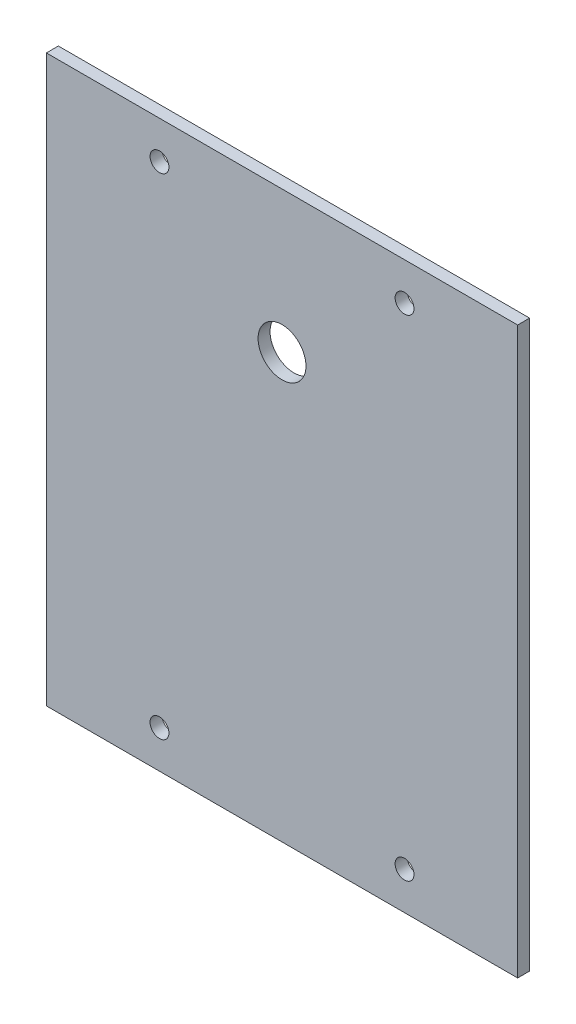
ISO-10303-21;
HEADER;
FILE_DESCRIPTION(('STEP AP214'),'2;1');
FILE_NAME('part.step','',(''),(''),'','','');
FILE_SCHEMA(('AUTOMOTIVE_DESIGN { 1 0 10303 214 1 1 1 1 }'));
ENDSEC;
DATA;
#1=APPLICATION_CONTEXT('core data for automotive mechanical design processes');
#2=APPLICATION_PROTOCOL_DEFINITION('international standard','automotive_design',2000,#1);
#3=PRODUCT_CONTEXT('',#1,'mechanical');
#4=PRODUCT('Part','Part','',(#3));
#5=PRODUCT_RELATED_PRODUCT_CATEGORY('part','',(#4));
#6=PRODUCT_DEFINITION_FORMATION('','',#4);
#7=PRODUCT_DEFINITION_CONTEXT('part definition',#1,'design');
#8=PRODUCT_DEFINITION('design','',#6,#7);
#9=PRODUCT_DEFINITION_SHAPE('','',#8);
#10=(LENGTH_UNIT() NAMED_UNIT(*) SI_UNIT(.MILLI.,.METRE.));
#11=(NAMED_UNIT(*) PLANE_ANGLE_UNIT() SI_UNIT($,.RADIAN.));
#12=(NAMED_UNIT(*) SI_UNIT($,.STERADIAN.) SOLID_ANGLE_UNIT());
#13=UNCERTAINTY_MEASURE_WITH_UNIT(LENGTH_MEASURE(1.E-05),#10,'distance_accuracy_value','');
#14=(GEOMETRIC_REPRESENTATION_CONTEXT(3) GLOBAL_UNCERTAINTY_ASSIGNED_CONTEXT((#13)) GLOBAL_UNIT_ASSIGNED_CONTEXT((#10,
#11,#12)) REPRESENTATION_CONTEXT('',''));
#15=CARTESIAN_POINT('',(0.,0.,0.));
#16=DIRECTION('',(0.,0.,1.));
#17=DIRECTION('',(1.,0.,0.));
#18=AXIS2_PLACEMENT_3D('',#15,#16,#17);
#19=CARTESIAN_POINT('',(-125.,150.,3.175));
#20=DIRECTION('',(1.,0.,0.));
#21=DIRECTION('',(0.,1.,0.));
#22=AXIS2_PLACEMENT_3D('',#19,#20,#21);
#23=PLANE('',#22);
#24=DIRECTION('',(0.,-1.,0.));
#25=VECTOR('',#24,1.);
#26=CARTESIAN_POINT('',(-125.,150.,0.));
#27=LINE('',#26,#25);
#28=CARTESIAN_POINT('',(-125.,150.,0.));
#29=VERTEX_POINT('',#28);
#30=CARTESIAN_POINT('',(-125.,0.,0.));
#31=VERTEX_POINT('',#30);
#32=EDGE_CURVE('E100',#29,#31,#27,.T.);
#33=ORIENTED_EDGE('',*,*,#32,.T.);
#34=DIRECTION('',(0.,0.,-1.));
#35=VECTOR('',#34,1.);
#36=CARTESIAN_POINT('',(-125.,0.,3.175));
#37=LINE('',#36,#35);
#38=CARTESIAN_POINT('',(-125.,0.,3.175));
#39=VERTEX_POINT('',#38);
#40=EDGE_CURVE('E11',#39,#31,#37,.T.);
#41=ORIENTED_EDGE('',*,*,#40,.F.);
#42=DIRECTION('',(0.,-1.,0.));
#43=VECTOR('',#42,1.);
#44=CARTESIAN_POINT('',(-125.,150.,3.175));
#45=LINE('',#44,#43);
#46=CARTESIAN_POINT('',(-125.,150.,3.175));
#47=VERTEX_POINT('',#46);
#48=EDGE_CURVE('E88',#47,#39,#45,.T.);
#49=ORIENTED_EDGE('',*,*,#48,.F.);
#50=DIRECTION('',(0.,0.,-1.));
#51=VECTOR('',#50,1.);
#52=CARTESIAN_POINT('',(-125.,150.,3.175));
#53=LINE('',#52,#51);
#54=EDGE_CURVE('E96',#47,#29,#53,.T.);
#55=ORIENTED_EDGE('',*,*,#54,.T.);
#56=EDGE_LOOP('',(#33,#41,#49,#55));
#57=FACE_BOUND('',#56,.T.);
#58=ADVANCED_FACE('F37',(#57),#23,.F.);
#59=CARTESIAN_POINT('',(-125.,0.,3.175));
#60=DIRECTION('',(0.,1.,0.));
#61=DIRECTION('',(0.,0.,1.));
#62=AXIS2_PLACEMENT_3D('',#59,#60,#61);
#63=PLANE('',#62);
#64=DIRECTION('',(1.,0.,0.));
#65=VECTOR('',#64,1.);
#66=CARTESIAN_POINT('',(-125.,0.,0.));
#67=LINE('',#66,#65);
#68=CARTESIAN_POINT('',(0.,0.,0.));
#69=VERTEX_POINT('',#68);
#70=EDGE_CURVE('E92',#31,#69,#67,.T.);
#71=ORIENTED_EDGE('',*,*,#70,.T.);
#72=DIRECTION('',(0.,0.,-1.));
#73=VECTOR('',#72,1.);
#74=CARTESIAN_POINT('',(0.,0.,3.175));
#75=LINE('',#74,#73);
#76=CARTESIAN_POINT('',(0.,0.,3.175));
#77=VERTEX_POINT('',#76);
#78=EDGE_CURVE('E45',#77,#69,#75,.T.);
#79=ORIENTED_EDGE('',*,*,#78,.F.);
#80=DIRECTION('',(1.,0.,0.));
#81=VECTOR('',#80,1.);
#82=CARTESIAN_POINT('',(-125.,0.,3.175));
#83=LINE('',#82,#81);
#84=EDGE_CURVE('E83',#39,#77,#83,.T.);
#85=ORIENTED_EDGE('',*,*,#84,.F.);
#86=ORIENTED_EDGE('',*,*,#40,.T.);
#87=EDGE_LOOP('',(#71,#79,#85,#86));
#88=FACE_BOUND('',#87,.T.);
#89=ADVANCED_FACE('F91',(#88),#63,.F.);
#90=CARTESIAN_POINT('',(0.,150.,3.175));
#91=DIRECTION('',(-1.,0.,0.));
#92=DIRECTION('',(0.,-1.,0.));
#93=AXIS2_PLACEMENT_3D('',#90,#91,#92);
#94=PLANE('',#93);
#95=DIRECTION('',(0.,1.,0.));
#96=VECTOR('',#95,1.);
#97=CARTESIAN_POINT('',(0.,150.,0.));
#98=LINE('',#97,#96);
#99=CARTESIAN_POINT('',(0.,150.,0.));
#100=VERTEX_POINT('',#99);
#101=EDGE_CURVE('E70',#69,#100,#98,.T.);
#102=ORIENTED_EDGE('',*,*,#101,.T.);
#103=DIRECTION('',(0.,0.,-1.));
#104=VECTOR('',#103,1.);
#105=CARTESIAN_POINT('',(0.,150.,3.175));
#106=LINE('',#105,#104);
#107=CARTESIAN_POINT('',(0.,150.,3.175));
#108=VERTEX_POINT('',#107);
#109=EDGE_CURVE('E93',#108,#100,#106,.T.);
#110=ORIENTED_EDGE('',*,*,#109,.F.);
#111=DIRECTION('',(0.,1.,0.));
#112=VECTOR('',#111,1.);
#113=CARTESIAN_POINT('',(0.,150.,3.175));
#114=LINE('',#113,#112);
#115=EDGE_CURVE('E86',#77,#108,#114,.T.);
#116=ORIENTED_EDGE('',*,*,#115,.F.);
#117=ORIENTED_EDGE('',*,*,#78,.T.);
#118=EDGE_LOOP('',(#102,#110,#116,#117));
#119=FACE_BOUND('',#118,.T.);
#120=ADVANCED_FACE('F94',(#119),#94,.F.);
#121=CARTESIAN_POINT('',(-125.,150.,3.175));
#122=DIRECTION('',(0.,-1.,0.));
#123=DIRECTION('',(0.,0.,-1.));
#124=AXIS2_PLACEMENT_3D('',#121,#122,#123);
#125=PLANE('',#124);
#126=DIRECTION('',(-1.,0.,0.));
#127=VECTOR('',#126,1.);
#128=CARTESIAN_POINT('',(-125.,150.,0.));
#129=LINE('',#128,#127);
#130=EDGE_CURVE('E76',#100,#29,#129,.T.);
#131=ORIENTED_EDGE('',*,*,#130,.T.);
#132=ORIENTED_EDGE('',*,*,#54,.F.);
#133=DIRECTION('',(-1.,0.,0.));
#134=VECTOR('',#133,1.);
#135=CARTESIAN_POINT('',(-125.,150.,3.175));
#136=LINE('',#135,#134);
#137=EDGE_CURVE('E53',#108,#47,#136,.T.);
#138=ORIENTED_EDGE('',*,*,#137,.F.);
#139=ORIENTED_EDGE('',*,*,#109,.T.);
#140=EDGE_LOOP('',(#131,#132,#138,#139));
#141=FACE_BOUND('',#140,.T.);
#142=ADVANCED_FACE('F108',(#141),#125,.F.);
#143=CARTESIAN_POINT('',(0.,0.,3.175));
#144=DIRECTION('',(0.,0.,1.));
#145=DIRECTION('',(1.,0.,0.));
#146=AXIS2_PLACEMENT_3D('',#143,#144,#145);
#147=PLANE('',#146);
#148=CARTESIAN_POINT('',(-62.5,112.5,3.175));
#149=DIRECTION('',(0.,0.,1.));
#150=DIRECTION('',(1.,0.,0.));
#151=AXIS2_PLACEMENT_3D('',#148,#149,#150);
#152=CIRCLE('',#151,6.35);
#153=CARTESIAN_POINT('',(-56.15,112.5,3.175));
#154=VERTEX_POINT('',#153);
#155=EDGE_CURVE('E140',#154,#154,#152,.T.);
#156=ORIENTED_EDGE('',*,*,#155,.F.);
#157=EDGE_LOOP('',(#156));
#158=FACE_BOUND('',#157,.T.);
#159=CARTESIAN_POINT('',(-95.,10.,3.175));
#160=DIRECTION('',(0.,0.,-1.));
#161=DIRECTION('',(1.,0.,0.));
#162=AXIS2_PLACEMENT_3D('',#159,#160,#161);
#163=CIRCLE('',#162,2.5);
#164=CARTESIAN_POINT('',(-92.5,10.,3.175));
#165=VERTEX_POINT('',#164);
#166=EDGE_CURVE('E129',#165,#165,#163,.T.);
#167=ORIENTED_EDGE('',*,*,#166,.T.);
#168=EDGE_LOOP('',(#167));
#169=FACE_BOUND('',#168,.T.);
#170=CARTESIAN_POINT('',(-30.,10.,3.175));
#171=DIRECTION('',(0.,0.,-1.));
#172=DIRECTION('',(1.,0.,0.));
#173=AXIS2_PLACEMENT_3D('',#170,#171,#172);
#174=CIRCLE('',#173,2.5);
#175=CARTESIAN_POINT('',(-27.5,10.,3.175));
#176=VERTEX_POINT('',#175);
#177=EDGE_CURVE('E130',#176,#176,#174,.T.);
#178=ORIENTED_EDGE('',*,*,#177,.T.);
#179=EDGE_LOOP('',(#178));
#180=FACE_BOUND('',#179,.T.);
#181=CARTESIAN_POINT('',(-95.,140.,3.175));
#182=DIRECTION('',(0.,0.,1.));
#183=DIRECTION('',(1.,0.,0.));
#184=AXIS2_PLACEMENT_3D('',#181,#182,#183);
#185=CIRCLE('',#184,2.5);
#186=CARTESIAN_POINT('',(-92.5,140.,3.175));
#187=VERTEX_POINT('',#186);
#188=EDGE_CURVE('E117',#187,#187,#185,.T.);
#189=ORIENTED_EDGE('',*,*,#188,.F.);
#190=EDGE_LOOP('',(#189));
#191=FACE_BOUND('',#190,.T.);
#192=CARTESIAN_POINT('',(-30.,140.,3.175));
#193=DIRECTION('',(0.,0.,1.));
#194=DIRECTION('',(1.,0.,0.));
#195=AXIS2_PLACEMENT_3D('',#192,#193,#194);
#196=CIRCLE('',#195,2.5);
#197=CARTESIAN_POINT('',(-27.5,140.,3.175));
#198=VERTEX_POINT('',#197);
#199=EDGE_CURVE('E114',#198,#198,#196,.T.);
#200=ORIENTED_EDGE('',*,*,#199,.F.);
#201=EDGE_LOOP('',(#200));
#202=FACE_BOUND('',#201,.T.);
#203=ORIENTED_EDGE('',*,*,#48,.T.);
#204=ORIENTED_EDGE('',*,*,#84,.T.);
#205=ORIENTED_EDGE('',*,*,#115,.T.);
#206=ORIENTED_EDGE('',*,*,#137,.T.);
#207=EDGE_LOOP('',(#203,#204,#205,#206));
#208=FACE_BOUND('',#207,.T.);
#209=ADVANCED_FACE('F84',(#158,#169,#180,#191,#202,#208),#147,.T.);
#210=CARTESIAN_POINT('',(0.,0.,0.));
#211=DIRECTION('',(0.,0.,1.));
#212=DIRECTION('',(1.,0.,0.));
#213=AXIS2_PLACEMENT_3D('',#210,#211,#212);
#214=PLANE('',#213);
#215=CARTESIAN_POINT('',(-62.5,112.5,0.));
#216=DIRECTION('',(0.,0.,1.));
#217=DIRECTION('',(1.,0.,0.));
#218=AXIS2_PLACEMENT_3D('',#215,#216,#217);
#219=CIRCLE('',#218,6.35);
#220=CARTESIAN_POINT('',(-56.15,112.5,0.));
#221=VERTEX_POINT('',#220);
#222=EDGE_CURVE('E133',#221,#221,#219,.F.);
#223=ORIENTED_EDGE('',*,*,#222,.F.);
#224=EDGE_LOOP('',(#223));
#225=FACE_BOUND('',#224,.T.);
#226=CARTESIAN_POINT('',(-95.,10.,0.));
#227=DIRECTION('',(0.,0.,1.));
#228=DIRECTION('',(1.,0.,0.));
#229=AXIS2_PLACEMENT_3D('',#226,#227,#228);
#230=CIRCLE('',#229,2.5);
#231=CARTESIAN_POINT('',(-92.5,10.,0.));
#232=VERTEX_POINT('',#231);
#233=EDGE_CURVE('E121',#232,#232,#230,.T.);
#234=ORIENTED_EDGE('',*,*,#233,.T.);
#235=EDGE_LOOP('',(#234));
#236=FACE_BOUND('',#235,.T.);
#237=CARTESIAN_POINT('',(-30.,10.,0.));
#238=DIRECTION('',(0.,0.,1.));
#239=DIRECTION('',(1.,0.,0.));
#240=AXIS2_PLACEMENT_3D('',#237,#238,#239);
#241=CIRCLE('',#240,2.5);
#242=CARTESIAN_POINT('',(-27.5,10.,0.));
#243=VERTEX_POINT('',#242);
#244=EDGE_CURVE('E126',#243,#243,#241,.T.);
#245=ORIENTED_EDGE('',*,*,#244,.T.);
#246=EDGE_LOOP('',(#245));
#247=FACE_BOUND('',#246,.T.);
#248=CARTESIAN_POINT('',(-95.,140.,0.));
#249=DIRECTION('',(0.,0.,1.));
#250=DIRECTION('',(1.,0.,0.));
#251=AXIS2_PLACEMENT_3D('',#248,#249,#250);
#252=CIRCLE('',#251,2.5);
#253=CARTESIAN_POINT('',(-92.5,140.,0.));
#254=VERTEX_POINT('',#253);
#255=EDGE_CURVE('E103',#254,#254,#252,.F.);
#256=ORIENTED_EDGE('',*,*,#255,.F.);
#257=EDGE_LOOP('',(#256));
#258=FACE_BOUND('',#257,.T.);
#259=CARTESIAN_POINT('',(-30.,140.,0.));
#260=DIRECTION('',(0.,0.,1.));
#261=DIRECTION('',(1.,0.,0.));
#262=AXIS2_PLACEMENT_3D('',#259,#260,#261);
#263=CIRCLE('',#262,2.5);
#264=CARTESIAN_POINT('',(-27.5,140.,0.));
#265=VERTEX_POINT('',#264);
#266=EDGE_CURVE('E118',#265,#265,#263,.F.);
#267=ORIENTED_EDGE('',*,*,#266,.F.);
#268=EDGE_LOOP('',(#267));
#269=FACE_BOUND('',#268,.T.);
#270=ORIENTED_EDGE('',*,*,#32,.F.);
#271=ORIENTED_EDGE('',*,*,#130,.F.);
#272=ORIENTED_EDGE('',*,*,#101,.F.);
#273=ORIENTED_EDGE('',*,*,#70,.F.);
#274=EDGE_LOOP('',(#270,#271,#272,#273));
#275=FACE_BOUND('',#274,.T.);
#276=ADVANCED_FACE('F111',(#225,#236,#247,#258,#269,#275),#214,.F.);
#277=CARTESIAN_POINT('',(-30.,140.,-7.07106781186548));
#278=DIRECTION('',(0.,0.,1.));
#279=DIRECTION('',(1.,0.,0.));
#280=AXIS2_PLACEMENT_3D('',#277,#278,#279);
#281=CYLINDRICAL_SURFACE('',#280,2.5);
#282=ORIENTED_EDGE('',*,*,#266,.T.);
#283=EDGE_LOOP('',(#282));
#284=FACE_BOUND('',#283,.T.);
#285=ORIENTED_EDGE('',*,*,#199,.T.);
#286=EDGE_LOOP('',(#285));
#287=FACE_BOUND('',#286,.T.);
#288=ADVANCED_FACE('F157',(#284,#287),#281,.F.);
#289=CARTESIAN_POINT('',(-95.,140.,-7.07106781186548));
#290=DIRECTION('',(0.,0.,1.));
#291=DIRECTION('',(1.,0.,0.));
#292=AXIS2_PLACEMENT_3D('',#289,#290,#291);
#293=CYLINDRICAL_SURFACE('',#292,2.5);
#294=ORIENTED_EDGE('',*,*,#255,.T.);
#295=EDGE_LOOP('',(#294));
#296=FACE_BOUND('',#295,.T.);
#297=ORIENTED_EDGE('',*,*,#188,.T.);
#298=EDGE_LOOP('',(#297));
#299=FACE_BOUND('',#298,.T.);
#300=ADVANCED_FACE('F159',(#296,#299),#293,.F.);
#301=CARTESIAN_POINT('',(-30.,10.,-7.07106781186547));
#302=DIRECTION('',(0.,0.,1.));
#303=DIRECTION('',(1.,0.,0.));
#304=AXIS2_PLACEMENT_3D('',#301,#302,#303);
#305=CYLINDRICAL_SURFACE('',#304,2.5);
#306=ORIENTED_EDGE('',*,*,#244,.F.);
#307=EDGE_LOOP('',(#306));
#308=FACE_BOUND('',#307,.T.);
#309=ORIENTED_EDGE('',*,*,#177,.F.);
#310=EDGE_LOOP('',(#309));
#311=FACE_BOUND('',#310,.T.);
#312=ADVANCED_FACE('F166',(#308,#311),#305,.F.);
#313=CARTESIAN_POINT('',(-95.,10.,-7.07106781186547));
#314=DIRECTION('',(0.,0.,1.));
#315=DIRECTION('',(1.,0.,0.));
#316=AXIS2_PLACEMENT_3D('',#313,#314,#315);
#317=CYLINDRICAL_SURFACE('',#316,2.5);
#318=ORIENTED_EDGE('',*,*,#233,.F.);
#319=EDGE_LOOP('',(#318));
#320=FACE_BOUND('',#319,.T.);
#321=ORIENTED_EDGE('',*,*,#166,.F.);
#322=EDGE_LOOP('',(#321));
#323=FACE_BOUND('',#322,.T.);
#324=ADVANCED_FACE('F204',(#320,#323),#317,.F.);
#325=CARTESIAN_POINT('',(-62.5,112.5,-17.9605122421383));
#326=DIRECTION('',(0.,0.,1.));
#327=DIRECTION('',(1.,0.,0.));
#328=AXIS2_PLACEMENT_3D('',#325,#326,#327);
#329=CYLINDRICAL_SURFACE('',#328,6.35);
#330=ORIENTED_EDGE('',*,*,#222,.T.);
#331=EDGE_LOOP('',(#330));
#332=FACE_BOUND('',#331,.T.);
#333=ORIENTED_EDGE('',*,*,#155,.T.);
#334=EDGE_LOOP('',(#333));
#335=FACE_BOUND('',#334,.T.);
#336=ADVANCED_FACE('F144',(#332,#335),#329,.F.);
#337=CLOSED_SHELL('',(#58,#89,#120,#142,#209,#276,#288,#300,#312,#324,#336));
#338=MANIFOLD_SOLID_BREP('B2',#337);
#339=ADVANCED_BREP_SHAPE_REPRESENTATION('',(#18,#338),#14);
#340=SHAPE_DEFINITION_REPRESENTATION(#9,#339);
ENDSEC;
END-ISO-10303-21;
